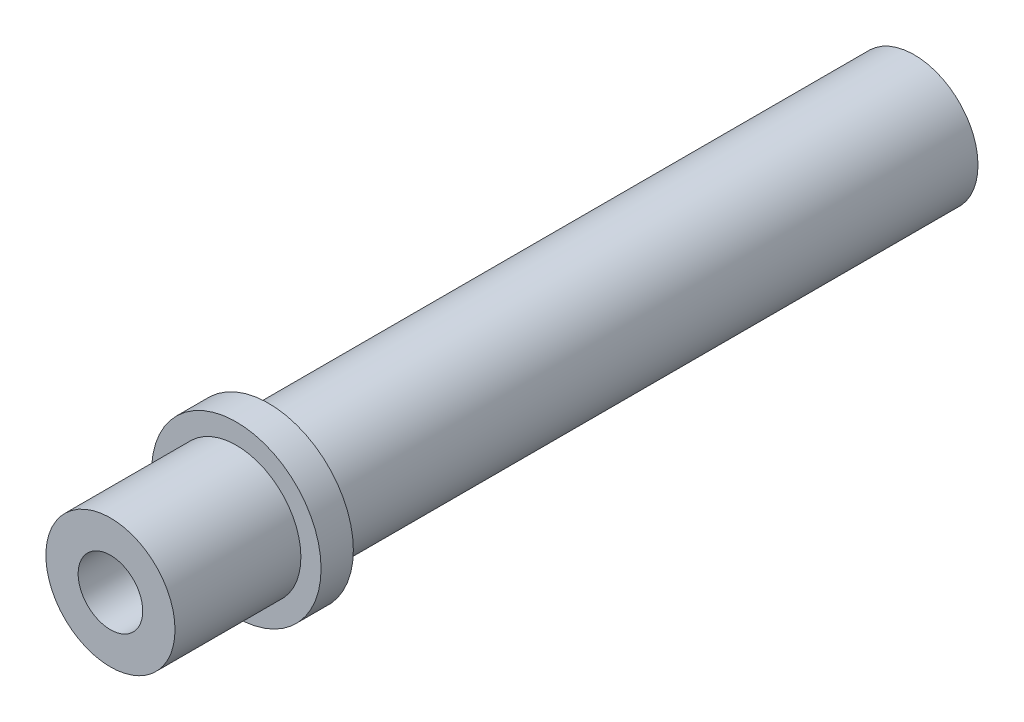
ISO-10303-21;
HEADER;
FILE_DESCRIPTION(('STEP AP214'),'2;1');
FILE_NAME('part.step','',(''),(''),'','','');
FILE_SCHEMA(('AUTOMOTIVE_DESIGN { 1 0 10303 214 1 1 1 1 }'));
ENDSEC;
DATA;
#1=APPLICATION_CONTEXT('core data for automotive mechanical design processes');
#2=APPLICATION_PROTOCOL_DEFINITION('international standard','automotive_design',2000,#1);
#3=PRODUCT_CONTEXT('',#1,'mechanical');
#4=PRODUCT('Part','Part','',(#3));
#5=PRODUCT_RELATED_PRODUCT_CATEGORY('part','',(#4));
#6=PRODUCT_DEFINITION_FORMATION('','',#4);
#7=PRODUCT_DEFINITION_CONTEXT('part definition',#1,'design');
#8=PRODUCT_DEFINITION('design','',#6,#7);
#9=PRODUCT_DEFINITION_SHAPE('','',#8);
#10=(LENGTH_UNIT() NAMED_UNIT(*) SI_UNIT(.MILLI.,.METRE.));
#11=(NAMED_UNIT(*) PLANE_ANGLE_UNIT() SI_UNIT($,.RADIAN.));
#12=(NAMED_UNIT(*) SI_UNIT($,.STERADIAN.) SOLID_ANGLE_UNIT());
#13=UNCERTAINTY_MEASURE_WITH_UNIT(LENGTH_MEASURE(1.E-05),#10,'distance_accuracy_value','');
#14=(GEOMETRIC_REPRESENTATION_CONTEXT(3) GLOBAL_UNCERTAINTY_ASSIGNED_CONTEXT((#13)) GLOBAL_UNIT_ASSIGNED_CONTEXT((#10,
#11,#12)) REPRESENTATION_CONTEXT('',''));
#15=CARTESIAN_POINT('',(0.,0.,0.));
#16=DIRECTION('',(0.,0.,1.));
#17=DIRECTION('',(1.,0.,0.));
#18=AXIS2_PLACEMENT_3D('',#15,#16,#17);
#19=CARTESIAN_POINT('',(0.,0.,40.));
#20=DIRECTION('',(0.,0.,-1.));
#21=DIRECTION('',(-1.,0.,0.));
#22=AXIS2_PLACEMENT_3D('',#19,#20,#21);
#23=CYLINDRICAL_SURFACE('',#22,3.95);
#24=CARTESIAN_POINT('',(0.,0.,40.));
#25=DIRECTION('',(0.,0.,1.));
#26=DIRECTION('',(1.,0.,0.));
#27=AXIS2_PLACEMENT_3D('',#24,#25,#26);
#28=CIRCLE('',#27,3.95);
#29=CARTESIAN_POINT('',(3.95,0.,40.));
#30=VERTEX_POINT('',#29);
#31=EDGE_CURVE('E42',#30,#30,#28,.T.);
#32=ORIENTED_EDGE('',*,*,#31,.F.);
#33=EDGE_LOOP('',(#32));
#34=FACE_BOUND('',#33,.T.);
#35=CARTESIAN_POINT('',(0.,0.,0.));
#36=DIRECTION('',(0.,0.,1.));
#37=DIRECTION('',(1.,0.,0.));
#38=AXIS2_PLACEMENT_3D('',#35,#36,#37);
#39=CIRCLE('',#38,3.95);
#40=CARTESIAN_POINT('',(3.95,0.,0.));
#41=VERTEX_POINT('',#40);
#42=EDGE_CURVE('E47',#41,#41,#39,.T.);
#43=ORIENTED_EDGE('',*,*,#42,.T.);
#44=EDGE_LOOP('',(#43));
#45=FACE_BOUND('',#44,.T.);
#46=ADVANCED_FACE('F40',(#34,#45),#23,.T.);
#47=CARTESIAN_POINT('',(0.,0.,0.));
#48=DIRECTION('',(0.,0.,1.));
#49=DIRECTION('',(1.,0.,0.));
#50=AXIS2_PLACEMENT_3D('',#47,#48,#49);
#51=PLANE('',#50);
#52=ORIENTED_EDGE('',*,*,#42,.F.);
#53=EDGE_LOOP('',(#52));
#54=FACE_BOUND('',#53,.T.);
#55=ADVANCED_FACE('F63',(#54),#51,.F.);
#56=CARTESIAN_POINT('',(0.,0.,42.));
#57=DIRECTION('',(0.,0.,-1.));
#58=DIRECTION('',(-1.,0.,0.));
#59=AXIS2_PLACEMENT_3D('',#56,#57,#58);
#60=CYLINDRICAL_SURFACE('',#59,5.25);
#61=CARTESIAN_POINT('',(0.,0.,42.));
#62=DIRECTION('',(0.,0.,1.));
#63=DIRECTION('',(1.,0.,0.));
#64=AXIS2_PLACEMENT_3D('',#61,#62,#63);
#65=CIRCLE('',#64,5.25);
#66=CARTESIAN_POINT('',(5.25,0.,42.));
#67=VERTEX_POINT('',#66);
#68=EDGE_CURVE('E54',#67,#67,#65,.T.);
#69=ORIENTED_EDGE('',*,*,#68,.F.);
#70=EDGE_LOOP('',(#69));
#71=FACE_BOUND('',#70,.T.);
#72=CARTESIAN_POINT('',(0.,0.,40.));
#73=DIRECTION('',(0.,0.,1.));
#74=DIRECTION('',(1.,0.,0.));
#75=AXIS2_PLACEMENT_3D('',#72,#73,#74);
#76=CIRCLE('',#75,5.25);
#77=CARTESIAN_POINT('',(5.25,0.,40.));
#78=VERTEX_POINT('',#77);
#79=EDGE_CURVE('E59',#78,#78,#76,.T.);
#80=ORIENTED_EDGE('',*,*,#79,.T.);
#81=EDGE_LOOP('',(#80));
#82=FACE_BOUND('',#81,.T.);
#83=ADVANCED_FACE('F66',(#71,#82),#60,.T.);
#84=CARTESIAN_POINT('',(0.,0.,42.));
#85=DIRECTION('',(0.,0.,1.));
#86=DIRECTION('',(1.,0.,0.));
#87=AXIS2_PLACEMENT_3D('',#84,#85,#86);
#88=PLANE('',#87);
#89=CARTESIAN_POINT('',(0.,0.,42.));
#90=DIRECTION('',(0.,0.,1.));
#91=DIRECTION('',(1.,0.,0.));
#92=AXIS2_PLACEMENT_3D('',#89,#90,#91);
#93=CIRCLE('',#92,4.);
#94=CARTESIAN_POINT('',(4.,0.,42.));
#95=VERTEX_POINT('',#94);
#96=EDGE_CURVE('E10',#95,#95,#93,.T.);
#97=ORIENTED_EDGE('',*,*,#96,.F.);
#98=EDGE_LOOP('',(#97));
#99=FACE_BOUND('',#98,.T.);
#100=ORIENTED_EDGE('',*,*,#68,.T.);
#101=EDGE_LOOP('',(#100));
#102=FACE_BOUND('',#101,.T.);
#103=ADVANCED_FACE('F72',(#99,#102),#88,.T.);
#104=CARTESIAN_POINT('',(0.,0.,40.));
#105=DIRECTION('',(0.,0.,1.));
#106=DIRECTION('',(1.,0.,0.));
#107=AXIS2_PLACEMENT_3D('',#104,#105,#106);
#108=PLANE('',#107);
#109=ORIENTED_EDGE('',*,*,#31,.T.);
#110=EDGE_LOOP('',(#109));
#111=FACE_BOUND('',#110,.T.);
#112=ORIENTED_EDGE('',*,*,#79,.F.);
#113=EDGE_LOOP('',(#112));
#114=FACE_BOUND('',#113,.T.);
#115=ADVANCED_FACE('F77',(#111,#114),#108,.F.);
#116=CARTESIAN_POINT('',(0.,0.,49.8));
#117=DIRECTION('',(0.,0.,-1.));
#118=DIRECTION('',(-1.,0.,0.));
#119=AXIS2_PLACEMENT_3D('',#116,#117,#118);
#120=CYLINDRICAL_SURFACE('',#119,4.);
#121=CARTESIAN_POINT('',(0.,0.,49.8));
#122=DIRECTION('',(0.,0.,1.));
#123=DIRECTION('',(1.,0.,0.));
#124=AXIS2_PLACEMENT_3D('',#121,#122,#123);
#125=CIRCLE('',#124,4.);
#126=CARTESIAN_POINT('',(4.,0.,49.8));
#127=VERTEX_POINT('',#126);
#128=EDGE_CURVE('E52',#127,#127,#125,.T.);
#129=ORIENTED_EDGE('',*,*,#128,.F.);
#130=EDGE_LOOP('',(#129));
#131=FACE_BOUND('',#130,.T.);
#132=ORIENTED_EDGE('',*,*,#96,.T.);
#133=EDGE_LOOP('',(#132));
#134=FACE_BOUND('',#133,.T.);
#135=ADVANCED_FACE('F79',(#131,#134),#120,.T.);
#136=CARTESIAN_POINT('',(0.,0.,49.8));
#137=DIRECTION('',(0.,0.,1.));
#138=DIRECTION('',(1.,0.,0.));
#139=AXIS2_PLACEMENT_3D('',#136,#137,#138);
#140=PLANE('',#139);
#141=CARTESIAN_POINT('',(0.,0.,49.8));
#142=DIRECTION('',(0.,0.,1.));
#143=DIRECTION('',(1.,0.,0.));
#144=AXIS2_PLACEMENT_3D('',#141,#142,#143);
#145=CIRCLE('',#144,2.);
#146=CARTESIAN_POINT('',(2.,0.,49.8));
#147=VERTEX_POINT('',#146);
#148=EDGE_CURVE('E37',#147,#147,#145,.F.);
#149=ORIENTED_EDGE('',*,*,#148,.T.);
#150=EDGE_LOOP('',(#149));
#151=FACE_BOUND('',#150,.T.);
#152=ORIENTED_EDGE('',*,*,#128,.T.);
#153=EDGE_LOOP('',(#152));
#154=FACE_BOUND('',#153,.T.);
#155=ADVANCED_FACE('F86',(#151,#154),#140,.T.);
#156=CARTESIAN_POINT('',(0.,0.,49.9));
#157=DIRECTION('',(0.,0.,-1.));
#158=DIRECTION('',(-1.,0.,0.));
#159=AXIS2_PLACEMENT_3D('',#156,#157,#158);
#160=CYLINDRICAL_SURFACE('',#159,2.);
#161=ORIENTED_EDGE('',*,*,#148,.F.);
#162=EDGE_LOOP('',(#161));
#163=FACE_BOUND('',#162,.T.);
#164=CARTESIAN_POINT('',(0.,0.,42.6));
#165=DIRECTION('',(0.,0.,1.));
#166=DIRECTION('',(1.,0.,0.));
#167=AXIS2_PLACEMENT_3D('',#164,#165,#166);
#168=CIRCLE('',#167,2.);
#169=CARTESIAN_POINT('',(2.,0.,42.6));
#170=VERTEX_POINT('',#169);
#171=EDGE_CURVE('E105',#170,#170,#168,.T.);
#172=ORIENTED_EDGE('',*,*,#171,.F.);
#173=EDGE_LOOP('',(#172));
#174=FACE_BOUND('',#173,.T.);
#175=ADVANCED_FACE('F89',(#163,#174),#160,.F.);
#176=CARTESIAN_POINT('',(0.,0.,42.6));
#177=DIRECTION('',(0.,0.,1.));
#178=DIRECTION('',(1.,0.,0.));
#179=AXIS2_PLACEMENT_3D('',#176,#177,#178);
#180=PLANE('',#179);
#181=ORIENTED_EDGE('',*,*,#171,.T.);
#182=EDGE_LOOP('',(#181));
#183=FACE_BOUND('',#182,.T.);
#184=ADVANCED_FACE('F94',(#183),#180,.T.);
#185=CLOSED_SHELL('',(#46,#55,#83,#103,#115,#135,#155,#175,#184));
#186=MANIFOLD_SOLID_BREP('B2',#185);
#187=ADVANCED_BREP_SHAPE_REPRESENTATION('',(#18,#186),#14);
#188=SHAPE_DEFINITION_REPRESENTATION(#9,#187);
ENDSEC;
END-ISO-10303-21;
